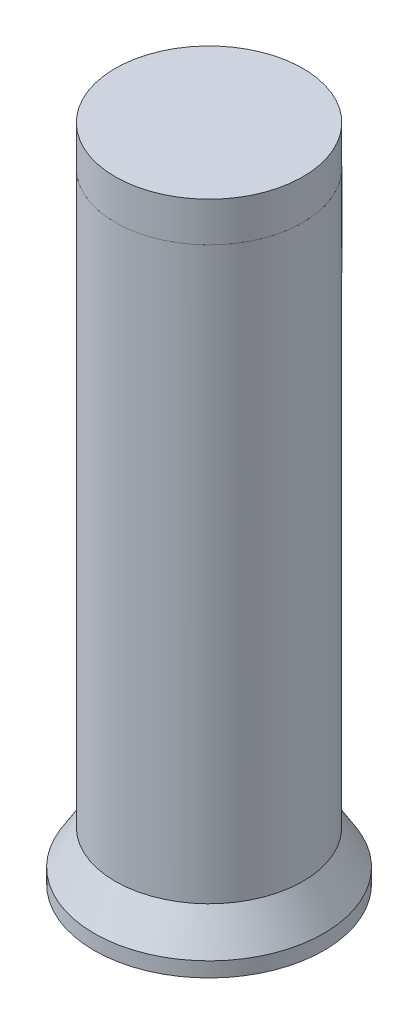
ISO-10303-21;
HEADER;
FILE_DESCRIPTION(('STEP AP214'),'2;1');
FILE_NAME('part.step','',(''),(''),'','','');
FILE_SCHEMA(('AUTOMOTIVE_DESIGN { 1 0 10303 214 1 1 1 1 }'));
ENDSEC;
DATA;
#1=APPLICATION_CONTEXT('core data for automotive mechanical design processes');
#2=APPLICATION_PROTOCOL_DEFINITION('international standard','automotive_design',2000,#1);
#3=PRODUCT_CONTEXT('',#1,'mechanical');
#4=PRODUCT('Part','Part','',(#3));
#5=PRODUCT_RELATED_PRODUCT_CATEGORY('part','',(#4));
#6=PRODUCT_DEFINITION_FORMATION('','',#4);
#7=PRODUCT_DEFINITION_CONTEXT('part definition',#1,'design');
#8=PRODUCT_DEFINITION('design','',#6,#7);
#9=PRODUCT_DEFINITION_SHAPE('','',#8);
#10=(LENGTH_UNIT() NAMED_UNIT(*) SI_UNIT(.MILLI.,.METRE.));
#11=(NAMED_UNIT(*) PLANE_ANGLE_UNIT() SI_UNIT($,.RADIAN.));
#12=(NAMED_UNIT(*) SI_UNIT($,.STERADIAN.) SOLID_ANGLE_UNIT());
#13=UNCERTAINTY_MEASURE_WITH_UNIT(LENGTH_MEASURE(1.E-05),#10,'distance_accuracy_value','');
#14=(GEOMETRIC_REPRESENTATION_CONTEXT(3) GLOBAL_UNCERTAINTY_ASSIGNED_CONTEXT((#13)) GLOBAL_UNIT_ASSIGNED_CONTEXT((#10,
#11,#12)) REPRESENTATION_CONTEXT('',''));
#15=CARTESIAN_POINT('',(0.,0.,0.));
#16=DIRECTION('',(0.,0.,1.));
#17=DIRECTION('',(1.,0.,0.));
#18=AXIS2_PLACEMENT_3D('',#15,#16,#17);
#19=CARTESIAN_POINT('',(46.5,267.,0.));
#20=DIRECTION('',(0.,-1.,0.));
#21=DIRECTION('',(0.,0.,-1.));
#22=AXIS2_PLACEMENT_3D('',#19,#20,#21);
#23=CYLINDRICAL_SURFACE('',#22,38.);
#24=CARTESIAN_POINT('',(46.5,267.,0.));
#25=DIRECTION('',(0.,1.,0.));
#26=DIRECTION('',(0.,0.,1.));
#27=AXIS2_PLACEMENT_3D('',#24,#25,#26);
#28=CIRCLE('',#27,38.);
#29=CARTESIAN_POINT('',(46.5,267.,38.));
#30=VERTEX_POINT('',#29);
#31=EDGE_CURVE('E11',#30,#30,#28,.T.);
#32=ORIENTED_EDGE('',*,*,#31,.F.);
#33=EDGE_LOOP('',(#32));
#34=FACE_BOUND('',#33,.T.);
#35=CARTESIAN_POINT('',(46.5,251.,0.));
#36=DIRECTION('',(0.,1.,0.));
#37=DIRECTION('',(0.,0.,1.));
#38=AXIS2_PLACEMENT_3D('',#35,#36,#37);
#39=CIRCLE('',#38,38.);
#40=CARTESIAN_POINT('',(46.5,251.,38.));
#41=VERTEX_POINT('',#40);
#42=EDGE_CURVE('E42',#41,#41,#39,.T.);
#43=ORIENTED_EDGE('',*,*,#42,.T.);
#44=EDGE_LOOP('',(#43));
#45=FACE_BOUND('',#44,.T.);
#46=ADVANCED_FACE('F39',(#34,#45),#23,.T.);
#47=CARTESIAN_POINT('',(46.5,267.,0.));
#48=DIRECTION('',(0.,1.,0.));
#49=DIRECTION('',(0.,0.,1.));
#50=AXIS2_PLACEMENT_3D('',#47,#48,#49);
#51=PLANE('',#50);
#52=ORIENTED_EDGE('',*,*,#31,.T.);
#53=EDGE_LOOP('',(#52));
#54=FACE_BOUND('',#53,.T.);
#55=ADVANCED_FACE('F54',(#54),#51,.T.);
#56=CARTESIAN_POINT('',(46.5,251.,0.));
#57=DIRECTION('',(0.,1.,0.));
#58=DIRECTION('',(0.,0.,1.));
#59=AXIS2_PLACEMENT_3D('',#56,#57,#58);
#60=PLANE('',#59);
#61=ORIENTED_EDGE('',*,*,#42,.F.);
#62=EDGE_LOOP('',(#61));
#63=FACE_BOUND('',#62,.T.);
#64=ADVANCED_FACE('F52',(#63),#60,.F.);
#65=CLOSED_SHELL('',(#46,#55,#64));
#66=MANIFOLD_SOLID_BREP('B2',#65);
#67=CARTESIAN_POINT('',(46.5,0.,0.));
#68=DIRECTION('',(0.,1.,0.));
#69=DIRECTION('',(0.,0.,1.));
#70=AXIS2_PLACEMENT_3D('',#67,#68,#69);
#71=CYLINDRICAL_SURFACE('',#70,31.5);
#72=CARTESIAN_POINT('',(46.5,251.,0.));
#73=DIRECTION('',(0.,-1.,0.));
#74=DIRECTION('',(0.,0.,-1.));
#75=AXIS2_PLACEMENT_3D('',#72,#73,#74);
#76=CIRCLE('',#75,31.5);
#77=CARTESIAN_POINT('',(46.5,251.,-31.5));
#78=VERTEX_POINT('',#77);
#79=EDGE_CURVE('E108',#78,#78,#76,.F.);
#80=ORIENTED_EDGE('',*,*,#79,.T.);
#81=EDGE_LOOP('',(#80));
#82=FACE_BOUND('',#81,.T.);
#83=CARTESIAN_POINT('',(46.5,9.,0.));
#84=DIRECTION('',(0.,-1.,0.));
#85=DIRECTION('',(0.,0.,-1.));
#86=AXIS2_PLACEMENT_3D('',#83,#84,#85);
#87=CIRCLE('',#86,31.5);
#88=CARTESIAN_POINT('',(46.5,9.,-31.5));
#89=VERTEX_POINT('',#88);
#90=EDGE_CURVE('E96',#89,#89,#87,.F.);
#91=ORIENTED_EDGE('',*,*,#90,.F.);
#92=EDGE_LOOP('',(#91));
#93=FACE_BOUND('',#92,.T.);
#94=ADVANCED_FACE('F80',(#82,#93),#71,.F.);
#95=CARTESIAN_POINT('',(0.,0.,0.));
#96=DIRECTION('',(0.,-1.,0.));
#97=DIRECTION('',(0.,0.,-1.));
#98=AXIS2_PLACEMENT_3D('',#95,#96,#97);
#99=PLANE('',#98);
#100=CARTESIAN_POINT('',(46.5,0.,0.));
#101=DIRECTION('',(0.,-1.,0.));
#102=DIRECTION('',(0.,0.,-1.));
#103=AXIS2_PLACEMENT_3D('',#100,#101,#102);
#104=CIRCLE('',#103,34.);
#105=CARTESIAN_POINT('',(46.5,0.,-34.));
#106=VERTEX_POINT('',#105);
#107=EDGE_CURVE('E103',#106,#106,#104,.T.);
#108=ORIENTED_EDGE('',*,*,#107,.F.);
#109=EDGE_LOOP('',(#108));
#110=FACE_BOUND('',#109,.T.);
#111=CARTESIAN_POINT('',(46.5,0.,0.));
#112=DIRECTION('',(0.,1.,0.));
#113=DIRECTION('',(0.,0.,1.));
#114=AXIS2_PLACEMENT_3D('',#111,#112,#113);
#115=CIRCLE('',#114,46.5);
#116=CARTESIAN_POINT('',(46.5,0.,46.5));
#117=VERTEX_POINT('',#116);
#118=EDGE_CURVE('E38',#117,#117,#115,.T.);
#119=ORIENTED_EDGE('',*,*,#118,.F.);
#120=EDGE_LOOP('',(#119));
#121=FACE_BOUND('',#120,.T.);
#122=ADVANCED_FACE('F82',(#110,#121),#99,.T.);
#123=CARTESIAN_POINT('',(46.5,292.214178217645,0.));
#124=DIRECTION('',(0.,1.,0.));
#125=DIRECTION('',(0.,0.,1.));
#126=AXIS2_PLACEMENT_3D('',#123,#124,#125);
#127=CYLINDRICAL_SURFACE('',#126,46.5);
#128=ORIENTED_EDGE('',*,*,#118,.T.);
#129=EDGE_LOOP('',(#128));
#130=FACE_BOUND('',#129,.T.);
#131=CARTESIAN_POINT('',(46.5,6.00000000000001,0.));
#132=DIRECTION('',(0.,1.,0.));
#133=DIRECTION('',(0.,0.,1.));
#134=AXIS2_PLACEMENT_3D('',#131,#132,#133);
#135=CIRCLE('',#134,46.5);
#136=CARTESIAN_POINT('',(46.5,6.00000000000001,46.5));
#137=VERTEX_POINT('',#136);
#138=EDGE_CURVE('E88',#137,#137,#135,.T.);
#139=ORIENTED_EDGE('',*,*,#138,.F.);
#140=EDGE_LOOP('',(#139));
#141=FACE_BOUND('',#140,.T.);
#142=ADVANCED_FACE('F129',(#130,#141),#127,.T.);
#143=CARTESIAN_POINT('',(46.5,20.,0.));
#144=DIRECTION('',(0.,-1.,0.));
#145=DIRECTION('',(0.,0.,-1.));
#146=AXIS2_PLACEMENT_3D('',#143,#144,#145);
#147=CONICAL_SURFACE('',#146,38.,0.545655054526991);
#148=ORIENTED_EDGE('',*,*,#138,.T.);
#149=EDGE_LOOP('',(#148));
#150=FACE_BOUND('',#149,.T.);
#151=CARTESIAN_POINT('',(46.5,20.,0.));
#152=DIRECTION('',(0.,1.,0.));
#153=DIRECTION('',(0.,0.,1.));
#154=AXIS2_PLACEMENT_3D('',#151,#152,#153);
#155=CIRCLE('',#154,38.);
#156=CARTESIAN_POINT('',(46.5,20.,38.));
#157=VERTEX_POINT('',#156);
#158=EDGE_CURVE('E93',#157,#157,#155,.T.);
#159=ORIENTED_EDGE('',*,*,#158,.F.);
#160=EDGE_LOOP('',(#159));
#161=FACE_BOUND('',#160,.T.);
#162=ADVANCED_FACE('F124',(#150,#161),#147,.T.);
#163=CARTESIAN_POINT('',(46.5,292.214178217645,0.));
#164=DIRECTION('',(0.,1.,0.));
#165=DIRECTION('',(0.,0.,1.));
#166=AXIS2_PLACEMENT_3D('',#163,#164,#165);
#167=CYLINDRICAL_SURFACE('',#166,38.);
#168=CARTESIAN_POINT('',(46.5,251.,0.));
#169=DIRECTION('',(0.,-1.,0.));
#170=DIRECTION('',(0.,0.,-1.));
#171=AXIS2_PLACEMENT_3D('',#168,#169,#170);
#172=CIRCLE('',#171,38.);
#173=CARTESIAN_POINT('',(46.5,251.,-38.));
#174=VERTEX_POINT('',#173);
#175=EDGE_CURVE('E84',#174,#174,#172,.F.);
#176=ORIENTED_EDGE('',*,*,#175,.F.);
#177=EDGE_LOOP('',(#176));
#178=FACE_BOUND('',#177,.T.);
#179=ORIENTED_EDGE('',*,*,#158,.T.);
#180=EDGE_LOOP('',(#179));
#181=FACE_BOUND('',#180,.T.);
#182=ADVANCED_FACE('F120',(#178,#181),#167,.T.);
#183=CARTESIAN_POINT('',(46.5,9.,0.));
#184=DIRECTION('',(0.,-1.,0.));
#185=DIRECTION('',(0.,0.,-1.));
#186=AXIS2_PLACEMENT_3D('',#183,#184,#185);
#187=PLANE('',#186);
#188=CARTESIAN_POINT('',(46.5,9.,0.));
#189=DIRECTION('',(0.,-1.,0.));
#190=DIRECTION('',(0.,0.,-1.));
#191=AXIS2_PLACEMENT_3D('',#188,#189,#190);
#192=CIRCLE('',#191,34.);
#193=CARTESIAN_POINT('',(46.5,9.,-34.));
#194=VERTEX_POINT('',#193);
#195=EDGE_CURVE('E98',#194,#194,#192,.T.);
#196=ORIENTED_EDGE('',*,*,#195,.T.);
#197=EDGE_LOOP('',(#196));
#198=FACE_BOUND('',#197,.T.);
#199=ORIENTED_EDGE('',*,*,#90,.T.);
#200=EDGE_LOOP('',(#199));
#201=FACE_BOUND('',#200,.T.);
#202=ADVANCED_FACE('F123',(#198,#201),#187,.T.);
#203=CARTESIAN_POINT('',(46.5,9.,0.));
#204=DIRECTION('',(0.,-1.,0.));
#205=DIRECTION('',(0.,0.,-1.));
#206=AXIS2_PLACEMENT_3D('',#203,#204,#205);
#207=CYLINDRICAL_SURFACE('',#206,34.);
#208=ORIENTED_EDGE('',*,*,#195,.F.);
#209=EDGE_LOOP('',(#208));
#210=FACE_BOUND('',#209,.T.);
#211=ORIENTED_EDGE('',*,*,#107,.T.);
#212=EDGE_LOOP('',(#211));
#213=FACE_BOUND('',#212,.T.);
#214=ADVANCED_FACE('F143',(#210,#213),#207,.F.);
#215=CARTESIAN_POINT('',(0.,251.,-50.));
#216=DIRECTION('',(0.,-1.,0.));
#217=DIRECTION('',(0.,0.,-1.));
#218=AXIS2_PLACEMENT_3D('',#215,#216,#217);
#219=PLANE('',#218);
#220=ORIENTED_EDGE('',*,*,#175,.T.);
#221=EDGE_LOOP('',(#220));
#222=FACE_BOUND('',#221,.T.);
#223=ORIENTED_EDGE('',*,*,#79,.F.);
#224=EDGE_LOOP('',(#223));
#225=FACE_BOUND('',#224,.T.);
#226=ADVANCED_FACE('F117',(#222,#225),#219,.F.);
#227=CLOSED_SHELL('',(#94,#122,#142,#162,#182,#202,#214,#226));
#228=MANIFOLD_SOLID_BREP('B6',#227);
#229=ADVANCED_BREP_SHAPE_REPRESENTATION('',(#18,#66,#228),#14);
#230=SHAPE_DEFINITION_REPRESENTATION(#9,#229);
ENDSEC;
END-ISO-10303-21;
